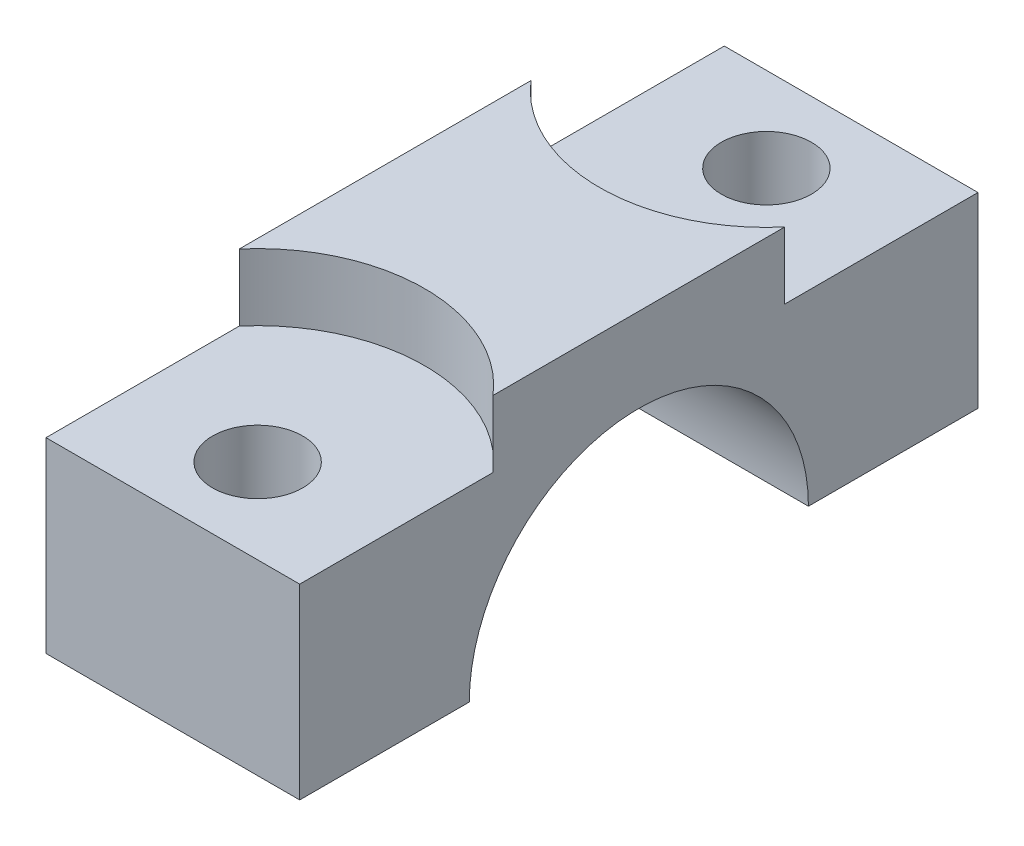
ISO-10303-21;
HEADER;
FILE_DESCRIPTION(('STEP AP214'),'2;1');
FILE_NAME('part.step','',(''),(''),'','','');
FILE_SCHEMA(('AUTOMOTIVE_DESIGN { 1 0 10303 214 1 1 1 1 }'));
ENDSEC;
DATA;
#1=APPLICATION_CONTEXT('core data for automotive mechanical design processes');
#2=APPLICATION_PROTOCOL_DEFINITION('international standard','automotive_design',2000,#1);
#3=PRODUCT_CONTEXT('',#1,'mechanical');
#4=PRODUCT('Part','Part','',(#3));
#5=PRODUCT_RELATED_PRODUCT_CATEGORY('part','',(#4));
#6=PRODUCT_DEFINITION_FORMATION('','',#4);
#7=PRODUCT_DEFINITION_CONTEXT('part definition',#1,'design');
#8=PRODUCT_DEFINITION('design','',#6,#7);
#9=PRODUCT_DEFINITION_SHAPE('','',#8);
#10=(LENGTH_UNIT() NAMED_UNIT(*) SI_UNIT(.MILLI.,.METRE.));
#11=(NAMED_UNIT(*) PLANE_ANGLE_UNIT() SI_UNIT($,.RADIAN.));
#12=(NAMED_UNIT(*) SI_UNIT($,.STERADIAN.) SOLID_ANGLE_UNIT());
#13=UNCERTAINTY_MEASURE_WITH_UNIT(LENGTH_MEASURE(1.E-05),#10,'distance_accuracy_value','');
#14=(GEOMETRIC_REPRESENTATION_CONTEXT(3) GLOBAL_UNCERTAINTY_ASSIGNED_CONTEXT((#13)) GLOBAL_UNIT_ASSIGNED_CONTEXT((#10,
#11,#12)) REPRESENTATION_CONTEXT('',''));
#15=CARTESIAN_POINT('',(0.,0.,0.));
#16=DIRECTION('',(0.,0.,1.));
#17=DIRECTION('',(1.,0.,0.));
#18=AXIS2_PLACEMENT_3D('',#15,#16,#17);
#19=CARTESIAN_POINT('',(9.5,0.,0.));
#20=DIRECTION('',(-1.,0.,0.));
#21=DIRECTION('',(0.,0.,1.));
#22=AXIS2_PLACEMENT_3D('',#19,#20,#21);
#23=CYLINDRICAL_SURFACE('',#22,12.7);
#24=CARTESIAN_POINT('',(-9.5,0.,0.));
#25=DIRECTION('',(1.,0.,0.));
#26=DIRECTION('',(0.,0.,-1.));
#27=AXIS2_PLACEMENT_3D('',#24,#25,#26);
#28=CIRCLE('',#27,12.7);
#29=CARTESIAN_POINT('',(-9.5,0.,-12.7));
#30=VERTEX_POINT('',#29);
#31=CARTESIAN_POINT('',(-9.5,0.,12.7));
#32=VERTEX_POINT('',#31);
#33=EDGE_CURVE('E145',#30,#32,#28,.T.);
#34=ORIENTED_EDGE('',*,*,#33,.F.);
#35=DIRECTION('',(-1.,0.,0.));
#36=VECTOR('',#35,1.);
#37=CARTESIAN_POINT('',(9.5,0.,-12.7));
#38=LINE('',#37,#36);
#39=CARTESIAN_POINT('',(9.5,0.,-12.7));
#40=VERTEX_POINT('',#39);
#41=EDGE_CURVE('E167',#40,#30,#38,.T.);
#42=ORIENTED_EDGE('',*,*,#41,.F.);
#43=CARTESIAN_POINT('',(9.5,0.,0.));
#44=DIRECTION('',(1.,0.,0.));
#45=DIRECTION('',(0.,0.,-1.));
#46=AXIS2_PLACEMENT_3D('',#43,#44,#45);
#47=CIRCLE('',#46,12.7);
#48=CARTESIAN_POINT('',(9.5,0.,12.7));
#49=VERTEX_POINT('',#48);
#50=EDGE_CURVE('E139',#40,#49,#47,.T.);
#51=ORIENTED_EDGE('',*,*,#50,.T.);
#52=DIRECTION('',(-1.,0.,0.));
#53=VECTOR('',#52,1.);
#54=CARTESIAN_POINT('',(9.5,0.,12.7));
#55=LINE('',#54,#53);
#56=EDGE_CURVE('E160',#49,#32,#55,.T.);
#57=ORIENTED_EDGE('',*,*,#56,.T.);
#58=EDGE_LOOP('',(#34,#42,#51,#57));
#59=FACE_BOUND('',#58,.T.);
#60=ADVANCED_FACE('F36',(#59),#23,.F.);
#61=CARTESIAN_POINT('',(9.5,0.,0.));
#62=DIRECTION('',(0.,1.,0.));
#63=DIRECTION('',(0.,0.,1.));
#64=AXIS2_PLACEMENT_3D('',#61,#62,#63);
#65=PLANE('',#64);
#66=CARTESIAN_POINT('',(0.,0.,-19.05));
#67=DIRECTION('',(0.,1.,0.));
#68=DIRECTION('',(0.,0.,1.));
#69=AXIS2_PLACEMENT_3D('',#66,#67,#68);
#70=CIRCLE('',#69,3.375);
#71=CARTESIAN_POINT('',(0.,0.,-15.675));
#72=VERTEX_POINT('',#71);
#73=EDGE_CURVE('E261',#72,#72,#70,.T.);
#74=ORIENTED_EDGE('',*,*,#73,.T.);
#75=EDGE_LOOP('',(#74));
#76=FACE_BOUND('',#75,.T.);
#77=DIRECTION('',(0.,0.,-1.));
#78=VECTOR('',#77,1.);
#79=CARTESIAN_POINT('',(-9.5,0.,0.));
#80=LINE('',#79,#78);
#81=CARTESIAN_POINT('',(-9.5,0.,-25.4));
#82=VERTEX_POINT('',#81);
#83=EDGE_CURVE('E148',#30,#82,#80,.T.);
#84=ORIENTED_EDGE('',*,*,#83,.T.);
#85=DIRECTION('',(-1.,0.,0.));
#86=VECTOR('',#85,1.);
#87=CARTESIAN_POINT('',(9.5,0.,-25.4));
#88=LINE('',#87,#86);
#89=CARTESIAN_POINT('',(9.5,0.,-25.4));
#90=VERTEX_POINT('',#89);
#91=EDGE_CURVE('E165',#90,#82,#88,.T.);
#92=ORIENTED_EDGE('',*,*,#91,.F.);
#93=DIRECTION('',(0.,0.,-1.));
#94=VECTOR('',#93,1.);
#95=CARTESIAN_POINT('',(9.5,0.,0.));
#96=LINE('',#95,#94);
#97=EDGE_CURVE('E131',#40,#90,#96,.T.);
#98=ORIENTED_EDGE('',*,*,#97,.F.);
#99=ORIENTED_EDGE('',*,*,#41,.T.);
#100=EDGE_LOOP('',(#84,#92,#98,#99));
#101=FACE_BOUND('',#100,.T.);
#102=ADVANCED_FACE('F206',(#76,#101),#65,.F.);
#103=CARTESIAN_POINT('',(9.5,0.,-25.4));
#104=DIRECTION('',(0.,0.,-1.));
#105=DIRECTION('',(-1.,0.,0.));
#106=AXIS2_PLACEMENT_3D('',#103,#104,#105);
#107=PLANE('',#106);
#108=DIRECTION('',(-1.,0.,0.));
#109=VECTOR('',#108,1.);
#110=CARTESIAN_POINT('',(9.5,14.,-25.4));
#111=LINE('',#110,#109);
#112=CARTESIAN_POINT('',(9.5,14.,-25.4));
#113=VERTEX_POINT('',#112);
#114=CARTESIAN_POINT('',(-9.5,14.,-25.4));
#115=VERTEX_POINT('',#114);
#116=EDGE_CURVE('E260',#113,#115,#111,.T.);
#117=ORIENTED_EDGE('',*,*,#116,.F.);
#118=DIRECTION('',(0.,-1.,0.));
#119=VECTOR('',#118,1.);
#120=CARTESIAN_POINT('',(9.5,0.,-25.4));
#121=LINE('',#120,#119);
#122=EDGE_CURVE('E128',#113,#90,#121,.T.);
#123=ORIENTED_EDGE('',*,*,#122,.T.);
#124=ORIENTED_EDGE('',*,*,#91,.T.);
#125=DIRECTION('',(0.,-1.,0.));
#126=VECTOR('',#125,1.);
#127=CARTESIAN_POINT('',(-9.5,0.,-25.4));
#128=LINE('',#127,#126);
#129=EDGE_CURVE('E152',#115,#82,#128,.T.);
#130=ORIENTED_EDGE('',*,*,#129,.F.);
#131=EDGE_LOOP('',(#117,#123,#124,#130));
#132=FACE_BOUND('',#131,.T.);
#133=ADVANCED_FACE('F234',(#132),#107,.T.);
#134=CARTESIAN_POINT('',(9.5,19.,0.));
#135=DIRECTION('',(0.,1.,0.));
#136=DIRECTION('',(0.,0.,1.));
#137=AXIS2_PLACEMENT_3D('',#134,#135,#136);
#138=PLANE('',#137);
#139=CARTESIAN_POINT('',(0.,19.,-19.05));
#140=DIRECTION('',(0.,1.,0.));
#141=DIRECTION('',(0.,0.,1.));
#142=AXIS2_PLACEMENT_3D('',#139,#140,#141);
#143=CIRCLE('',#142,12.5);
#144=CARTESIAN_POINT('',(-9.5,19.,-10.925961595364));
#145=VERTEX_POINT('',#144);
#146=CARTESIAN_POINT('',(9.5,19.,-10.925961595364));
#147=VERTEX_POINT('',#146);
#148=EDGE_CURVE('E50',#145,#147,#143,.T.);
#149=ORIENTED_EDGE('',*,*,#148,.F.);
#150=DIRECTION('',(0.,0.,-1.));
#151=VECTOR('',#150,1.);
#152=CARTESIAN_POINT('',(-9.5,19.,0.));
#153=LINE('',#152,#151);
#154=CARTESIAN_POINT('',(-9.5,19.,10.925961595364));
#155=VERTEX_POINT('',#154);
#156=EDGE_CURVE('E155',#155,#145,#153,.T.);
#157=ORIENTED_EDGE('',*,*,#156,.F.);
#158=CARTESIAN_POINT('',(0.,19.,19.05));
#159=DIRECTION('',(0.,1.,0.));
#160=DIRECTION('',(0.,0.,1.));
#161=AXIS2_PLACEMENT_3D('',#158,#159,#160);
#162=CIRCLE('',#161,12.5);
#163=CARTESIAN_POINT('',(9.5,19.,10.925961595364));
#164=VERTEX_POINT('',#163);
#165=EDGE_CURVE('E58',#164,#155,#162,.T.);
#166=ORIENTED_EDGE('',*,*,#165,.F.);
#167=DIRECTION('',(0.,0.,-1.));
#168=VECTOR('',#167,1.);
#169=CARTESIAN_POINT('',(9.5,19.,0.));
#170=LINE('',#169,#168);
#171=EDGE_CURVE('E135',#164,#147,#170,.T.);
#172=ORIENTED_EDGE('',*,*,#171,.T.);
#173=EDGE_LOOP('',(#149,#157,#166,#172));
#174=FACE_BOUND('',#173,.T.);
#175=ADVANCED_FACE('F240',(#174),#138,.T.);
#176=CARTESIAN_POINT('',(9.5,0.,25.4));
#177=DIRECTION('',(0.,0.,-1.));
#178=DIRECTION('',(0.,1.,0.));
#179=AXIS2_PLACEMENT_3D('',#176,#177,#178);
#180=PLANE('',#179);
#181=DIRECTION('',(0.,-1.,0.));
#182=VECTOR('',#181,1.);
#183=CARTESIAN_POINT('',(9.5,0.,25.4));
#184=LINE('',#183,#182);
#185=CARTESIAN_POINT('',(9.5,14.,25.4));
#186=VERTEX_POINT('',#185);
#187=CARTESIAN_POINT('',(9.5,0.,25.4));
#188=VERTEX_POINT('',#187);
#189=EDGE_CURVE('E137',#186,#188,#184,.T.);
#190=ORIENTED_EDGE('',*,*,#189,.F.);
#191=DIRECTION('',(-1.,0.,0.));
#192=VECTOR('',#191,1.);
#193=CARTESIAN_POINT('',(9.5,14.,25.4));
#194=LINE('',#193,#192);
#195=CARTESIAN_POINT('',(-9.5,14.,25.4));
#196=VERTEX_POINT('',#195);
#197=EDGE_CURVE('E182',#186,#196,#194,.T.);
#198=ORIENTED_EDGE('',*,*,#197,.T.);
#199=DIRECTION('',(0.,-1.,0.));
#200=VECTOR('',#199,1.);
#201=CARTESIAN_POINT('',(-9.5,0.,25.4));
#202=LINE('',#201,#200);
#203=CARTESIAN_POINT('',(-9.5,0.,25.4));
#204=VERTEX_POINT('',#203);
#205=EDGE_CURVE('E158',#196,#204,#202,.T.);
#206=ORIENTED_EDGE('',*,*,#205,.T.);
#207=DIRECTION('',(-1.,0.,0.));
#208=VECTOR('',#207,1.);
#209=CARTESIAN_POINT('',(9.5,0.,25.4));
#210=LINE('',#209,#208);
#211=EDGE_CURVE('E162',#188,#204,#210,.T.);
#212=ORIENTED_EDGE('',*,*,#211,.F.);
#213=EDGE_LOOP('',(#190,#198,#206,#212));
#214=FACE_BOUND('',#213,.T.);
#215=ADVANCED_FACE('F188',(#214),#180,.F.);
#216=CARTESIAN_POINT('',(0.,0.,19.05));
#217=DIRECTION('',(0.,1.,0.));
#218=DIRECTION('',(0.,0.,1.));
#219=AXIS2_PLACEMENT_3D('',#216,#217,#218);
#220=CIRCLE('',#219,3.375);
#221=CARTESIAN_POINT('',(0.,0.,22.425));
#222=VERTEX_POINT('',#221);
#223=EDGE_CURVE('E193',#222,#222,#220,.T.);
#224=ORIENTED_EDGE('',*,*,#223,.T.);
#225=EDGE_LOOP('',(#224));
#226=FACE_BOUND('',#225,.T.);
#227=EDGE_CURVE('E153',#204,#32,#80,.T.);
#228=ORIENTED_EDGE('',*,*,#227,.T.);
#229=ORIENTED_EDGE('',*,*,#56,.F.);
#230=EDGE_CURVE('E141',#188,#49,#96,.T.);
#231=ORIENTED_EDGE('',*,*,#230,.F.);
#232=ORIENTED_EDGE('',*,*,#211,.T.);
#233=EDGE_LOOP('',(#228,#229,#231,#232));
#234=FACE_BOUND('',#233,.T.);
#235=ADVANCED_FACE('F201',(#226,#234),#65,.F.);
#236=CARTESIAN_POINT('',(9.5,0.,0.));
#237=DIRECTION('',(1.,0.,0.));
#238=DIRECTION('',(0.,0.,-1.));
#239=AXIS2_PLACEMENT_3D('',#236,#237,#238);
#240=PLANE('',#239);
#241=DIRECTION('',(0.,0.,-1.));
#242=VECTOR('',#241,1.);
#243=CARTESIAN_POINT('',(9.5,14.,0.));
#244=LINE('',#243,#242);
#245=CARTESIAN_POINT('',(9.5,14.,-10.925961595364));
#246=VERTEX_POINT('',#245);
#247=EDGE_CURVE('E11',#246,#113,#244,.T.);
#248=ORIENTED_EDGE('',*,*,#247,.F.);
#249=DIRECTION('',(0.,1.,0.));
#250=VECTOR('',#249,1.);
#251=CARTESIAN_POINT('',(9.5,19.,-10.925961595364));
#252=LINE('',#251,#250);
#253=EDGE_CURVE('E43',#147,#246,#252,.F.);
#254=ORIENTED_EDGE('',*,*,#253,.F.);
#255=ORIENTED_EDGE('',*,*,#171,.F.);
#256=DIRECTION('',(0.,1.,0.));
#257=VECTOR('',#256,1.);
#258=CARTESIAN_POINT('',(9.5,19.,10.925961595364));
#259=LINE('',#258,#257);
#260=CARTESIAN_POINT('',(9.5,14.,10.925961595364));
#261=VERTEX_POINT('',#260);
#262=EDGE_CURVE('E190',#261,#164,#259,.T.);
#263=ORIENTED_EDGE('',*,*,#262,.F.);
#264=DIRECTION('',(0.,0.,-1.));
#265=VECTOR('',#264,1.);
#266=CARTESIAN_POINT('',(9.5,14.,0.));
#267=LINE('',#266,#265);
#268=EDGE_CURVE('E149',#186,#261,#267,.T.);
#269=ORIENTED_EDGE('',*,*,#268,.F.);
#270=ORIENTED_EDGE('',*,*,#189,.T.);
#271=ORIENTED_EDGE('',*,*,#230,.T.);
#272=ORIENTED_EDGE('',*,*,#50,.F.);
#273=ORIENTED_EDGE('',*,*,#97,.T.);
#274=ORIENTED_EDGE('',*,*,#122,.F.);
#275=EDGE_LOOP('',(#248,#254,#255,#263,#269,#270,#271,#272,#273,#274));
#276=FACE_BOUND('',#275,.T.);
#277=ADVANCED_FACE('F126',(#276),#240,.T.);
#278=CARTESIAN_POINT('',(-9.5,0.,0.));
#279=DIRECTION('',(1.,0.,0.));
#280=DIRECTION('',(0.,0.,-1.));
#281=AXIS2_PLACEMENT_3D('',#278,#279,#280);
#282=PLANE('',#281);
#283=DIRECTION('',(0.,1.,0.));
#284=VECTOR('',#283,1.);
#285=CARTESIAN_POINT('',(-9.5,19.,-10.925961595364));
#286=LINE('',#285,#284);
#287=CARTESIAN_POINT('',(-9.5,14.,-10.925961595364));
#288=VERTEX_POINT('',#287);
#289=EDGE_CURVE('E258',#145,#288,#286,.F.);
#290=ORIENTED_EDGE('',*,*,#289,.T.);
#291=DIRECTION('',(0.,0.,-1.));
#292=VECTOR('',#291,1.);
#293=CARTESIAN_POINT('',(-9.5,14.,0.));
#294=LINE('',#293,#292);
#295=EDGE_CURVE('E122',#288,#115,#294,.T.);
#296=ORIENTED_EDGE('',*,*,#295,.T.);
#297=ORIENTED_EDGE('',*,*,#129,.T.);
#298=ORIENTED_EDGE('',*,*,#83,.F.);
#299=ORIENTED_EDGE('',*,*,#33,.T.);
#300=ORIENTED_EDGE('',*,*,#227,.F.);
#301=ORIENTED_EDGE('',*,*,#205,.F.);
#302=DIRECTION('',(0.,0.,-1.));
#303=VECTOR('',#302,1.);
#304=CARTESIAN_POINT('',(-9.5,14.,0.));
#305=LINE('',#304,#303);
#306=CARTESIAN_POINT('',(-9.5,14.,10.925961595364));
#307=VERTEX_POINT('',#306);
#308=EDGE_CURVE('E117',#196,#307,#305,.T.);
#309=ORIENTED_EDGE('',*,*,#308,.T.);
#310=DIRECTION('',(0.,1.,0.));
#311=VECTOR('',#310,1.);
#312=CARTESIAN_POINT('',(-9.5,19.,10.925961595364));
#313=LINE('',#312,#311);
#314=EDGE_CURVE('E169',#307,#155,#313,.T.);
#315=ORIENTED_EDGE('',*,*,#314,.T.);
#316=ORIENTED_EDGE('',*,*,#156,.T.);
#317=EDGE_LOOP('',(#290,#296,#297,#298,#299,#300,#301,#309,#315,#316));
#318=FACE_BOUND('',#317,.T.);
#319=ADVANCED_FACE('F174',(#318),#282,.F.);
#320=CARTESIAN_POINT('',(0.,19.,19.05));
#321=DIRECTION('',(0.,1.,0.));
#322=DIRECTION('',(0.,0.,1.));
#323=AXIS2_PLACEMENT_3D('',#320,#321,#322);
#324=CYLINDRICAL_SURFACE('',#323,3.375);
#325=ORIENTED_EDGE('',*,*,#223,.F.);
#326=EDGE_LOOP('',(#325));
#327=FACE_BOUND('',#326,.T.);
#328=CARTESIAN_POINT('',(0.,14.,19.05));
#329=DIRECTION('',(0.,1.,0.));
#330=DIRECTION('',(0.,0.,1.));
#331=AXIS2_PLACEMENT_3D('',#328,#329,#330);
#332=CIRCLE('',#331,3.375);
#333=CARTESIAN_POINT('',(0.,14.,22.425));
#334=VERTEX_POINT('',#333);
#335=EDGE_CURVE('E209',#334,#334,#332,.T.);
#336=ORIENTED_EDGE('',*,*,#335,.T.);
#337=EDGE_LOOP('',(#336));
#338=FACE_BOUND('',#337,.T.);
#339=ADVANCED_FACE('F219',(#327,#338),#324,.F.);
#340=CARTESIAN_POINT('',(3.375,14.,19.05));
#341=DIRECTION('',(0.,-1.,0.));
#342=DIRECTION('',(0.,0.,-1.));
#343=AXIS2_PLACEMENT_3D('',#340,#341,#342);
#344=PLANE('',#343);
#345=ORIENTED_EDGE('',*,*,#268,.T.);
#346=CARTESIAN_POINT('',(0.,14.,19.05));
#347=DIRECTION('',(0.,1.,0.));
#348=DIRECTION('',(0.,0.,1.));
#349=AXIS2_PLACEMENT_3D('',#346,#347,#348);
#350=CIRCLE('',#349,12.5);
#351=EDGE_CURVE('E185',#261,#307,#350,.T.);
#352=ORIENTED_EDGE('',*,*,#351,.T.);
#353=ORIENTED_EDGE('',*,*,#308,.F.);
#354=ORIENTED_EDGE('',*,*,#197,.F.);
#355=EDGE_LOOP('',(#345,#352,#353,#354));
#356=FACE_BOUND('',#355,.T.);
#357=ORIENTED_EDGE('',*,*,#335,.F.);
#358=EDGE_LOOP('',(#357));
#359=FACE_BOUND('',#358,.T.);
#360=ADVANCED_FACE('F180',(#356,#359),#344,.F.);
#361=CARTESIAN_POINT('',(0.,19.,19.05));
#362=DIRECTION('',(0.,1.,0.));
#363=DIRECTION('',(0.,0.,1.));
#364=AXIS2_PLACEMENT_3D('',#361,#362,#363);
#365=CYLINDRICAL_SURFACE('',#364,12.5);
#366=ORIENTED_EDGE('',*,*,#262,.T.);
#367=ORIENTED_EDGE('',*,*,#165,.T.);
#368=ORIENTED_EDGE('',*,*,#314,.F.);
#369=ORIENTED_EDGE('',*,*,#351,.F.);
#370=EDGE_LOOP('',(#366,#367,#368,#369));
#371=FACE_BOUND('',#370,.T.);
#372=ADVANCED_FACE('F208',(#371),#365,.F.);
#373=CARTESIAN_POINT('',(3.375,14.,-19.05));
#374=DIRECTION('',(0.,-1.,0.));
#375=DIRECTION('',(0.,0.,-1.));
#376=AXIS2_PLACEMENT_3D('',#373,#374,#375);
#377=PLANE('',#376);
#378=CARTESIAN_POINT('',(0.,14.,-19.05));
#379=DIRECTION('',(0.,1.,0.));
#380=DIRECTION('',(0.,0.,1.));
#381=AXIS2_PLACEMENT_3D('',#378,#379,#380);
#382=CIRCLE('',#381,3.375);
#383=CARTESIAN_POINT('',(0.,14.,-15.675));
#384=VERTEX_POINT('',#383);
#385=EDGE_CURVE('E123',#384,#384,#382,.T.);
#386=ORIENTED_EDGE('',*,*,#385,.F.);
#387=EDGE_LOOP('',(#386));
#388=FACE_BOUND('',#387,.T.);
#389=CARTESIAN_POINT('',(0.,14.,-19.05));
#390=DIRECTION('',(0.,1.,0.));
#391=DIRECTION('',(0.,0.,1.));
#392=AXIS2_PLACEMENT_3D('',#389,#390,#391);
#393=CIRCLE('',#392,12.5);
#394=EDGE_CURVE('E111',#288,#246,#393,.T.);
#395=ORIENTED_EDGE('',*,*,#394,.T.);
#396=ORIENTED_EDGE('',*,*,#247,.T.);
#397=ORIENTED_EDGE('',*,*,#116,.T.);
#398=ORIENTED_EDGE('',*,*,#295,.F.);
#399=EDGE_LOOP('',(#395,#396,#397,#398));
#400=FACE_BOUND('',#399,.T.);
#401=ADVANCED_FACE('F119',(#388,#400),#377,.F.);
#402=CARTESIAN_POINT('',(0.,19.,-19.05));
#403=DIRECTION('',(0.,1.,0.));
#404=DIRECTION('',(0.,0.,1.));
#405=AXIS2_PLACEMENT_3D('',#402,#403,#404);
#406=CYLINDRICAL_SURFACE('',#405,12.5);
#407=ORIENTED_EDGE('',*,*,#148,.T.);
#408=ORIENTED_EDGE('',*,*,#253,.T.);
#409=ORIENTED_EDGE('',*,*,#394,.F.);
#410=ORIENTED_EDGE('',*,*,#289,.F.);
#411=EDGE_LOOP('',(#407,#408,#409,#410));
#412=FACE_BOUND('',#411,.T.);
#413=ADVANCED_FACE('F110',(#412),#406,.F.);
#414=CARTESIAN_POINT('',(0.,19.,-19.05));
#415=DIRECTION('',(0.,1.,0.));
#416=DIRECTION('',(0.,0.,1.));
#417=AXIS2_PLACEMENT_3D('',#414,#415,#416);
#418=CYLINDRICAL_SURFACE('',#417,3.375);
#419=ORIENTED_EDGE('',*,*,#73,.F.);
#420=EDGE_LOOP('',(#419));
#421=FACE_BOUND('',#420,.T.);
#422=ORIENTED_EDGE('',*,*,#385,.T.);
#423=EDGE_LOOP('',(#422));
#424=FACE_BOUND('',#423,.T.);
#425=ADVANCED_FACE('F269',(#421,#424),#418,.F.);
#426=CLOSED_SHELL('',(#60,#102,#133,#175,#215,#235,#277,#319,#339,#360,#372,#401,#413,#425));
#427=MANIFOLD_SOLID_BREP('B2',#426);
#428=ADVANCED_BREP_SHAPE_REPRESENTATION('',(#18,#427),#14);
#429=SHAPE_DEFINITION_REPRESENTATION(#9,#428);
ENDSEC;
END-ISO-10303-21;
